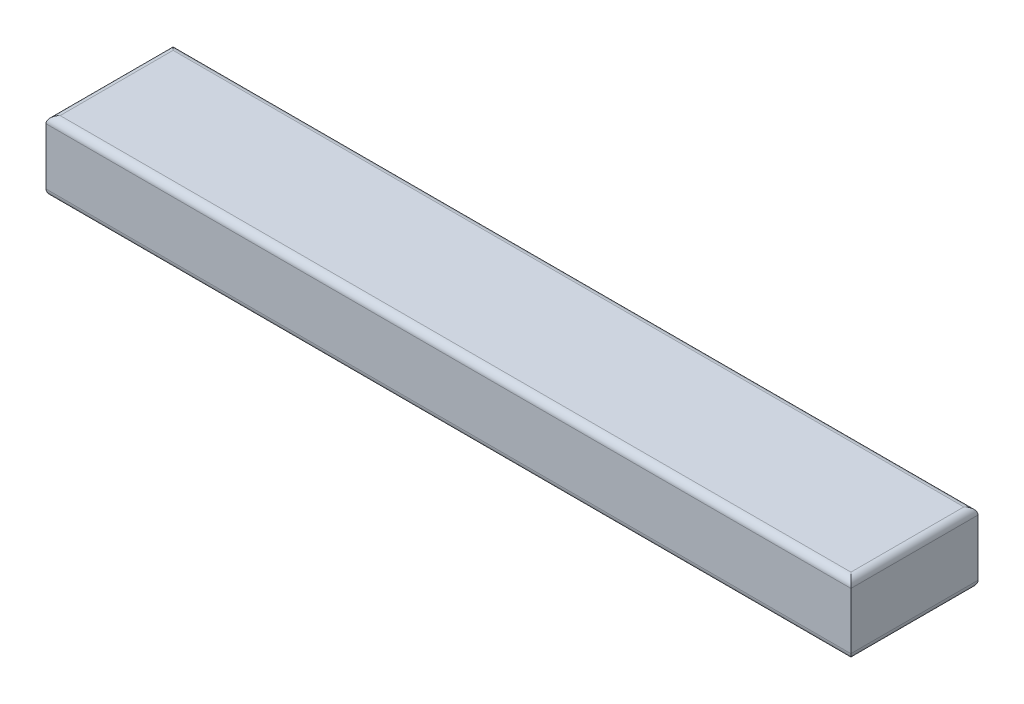
ISO-10303-21;
HEADER;
FILE_DESCRIPTION(('STEP AP214'),'2;1');
FILE_NAME('part.step','',(''),(''),'','','');
FILE_SCHEMA(('AUTOMOTIVE_DESIGN { 1 0 10303 214 1 1 1 1 }'));
ENDSEC;
DATA;
#1=APPLICATION_CONTEXT('core data for automotive mechanical design processes');
#2=APPLICATION_PROTOCOL_DEFINITION('international standard','automotive_design',2000,#1);
#3=PRODUCT_CONTEXT('',#1,'mechanical');
#4=PRODUCT('Part','Part','',(#3));
#5=PRODUCT_RELATED_PRODUCT_CATEGORY('part','',(#4));
#6=PRODUCT_DEFINITION_FORMATION('','',#4);
#7=PRODUCT_DEFINITION_CONTEXT('part definition',#1,'design');
#8=PRODUCT_DEFINITION('design','',#6,#7);
#9=PRODUCT_DEFINITION_SHAPE('','',#8);
#10=(LENGTH_UNIT() NAMED_UNIT(*) SI_UNIT(.MILLI.,.METRE.));
#11=(NAMED_UNIT(*) PLANE_ANGLE_UNIT() SI_UNIT($,.RADIAN.));
#12=(NAMED_UNIT(*) SI_UNIT($,.STERADIAN.) SOLID_ANGLE_UNIT());
#13=UNCERTAINTY_MEASURE_WITH_UNIT(LENGTH_MEASURE(1.E-05),#10,'distance_accuracy_value','');
#14=(GEOMETRIC_REPRESENTATION_CONTEXT(3) GLOBAL_UNCERTAINTY_ASSIGNED_CONTEXT((#13)) GLOBAL_UNIT_ASSIGNED_CONTEXT((#10,
#11,#12)) REPRESENTATION_CONTEXT('',''));
#15=CARTESIAN_POINT('',(0.,0.,0.));
#16=DIRECTION('',(0.,0.,1.));
#17=DIRECTION('',(1.,0.,0.));
#18=AXIS2_PLACEMENT_3D('',#15,#16,#17);
#19=CARTESIAN_POINT('',(-14.478,2.54,2.286));
#20=DIRECTION('',(1.,0.,0.));
#21=DIRECTION('',(0.,0.,-1.));
#22=AXIS2_PLACEMENT_3D('',#19,#20,#21);
#23=PLANE('',#22);
#24=DIRECTION('',(0.,-1.,0.));
#25=VECTOR('',#24,1.);
#26=CARTESIAN_POINT('',(-14.478,2.54,-2.286));
#27=LINE('',#26,#25);
#28=CARTESIAN_POINT('',(-14.478,2.286,-2.286));
#29=VERTEX_POINT('',#28);
#30=CARTESIAN_POINT('',(-14.478,0.254,-2.286));
#31=VERTEX_POINT('',#30);
#32=EDGE_CURVE('E153',#29,#31,#27,.T.);
#33=ORIENTED_EDGE('',*,*,#32,.T.);
#34=DIRECTION('',(0.,0.,1.));
#35=VECTOR('',#34,1.);
#36=CARTESIAN_POINT('',(-14.478,0.254,2.286));
#37=LINE('',#36,#35);
#38=CARTESIAN_POINT('',(-14.478,0.254,2.286));
#39=VERTEX_POINT('',#38);
#40=EDGE_CURVE('E162',#31,#39,#37,.T.);
#41=ORIENTED_EDGE('',*,*,#40,.T.);
#42=DIRECTION('',(0.,-1.,0.));
#43=VECTOR('',#42,1.);
#44=CARTESIAN_POINT('',(-14.478,2.54,2.286));
#45=LINE('',#44,#43);
#46=CARTESIAN_POINT('',(-14.478,2.286,2.286));
#47=VERTEX_POINT('',#46);
#48=EDGE_CURVE('E131',#47,#39,#45,.T.);
#49=ORIENTED_EDGE('',*,*,#48,.F.);
#50=DIRECTION('',(0.,0.,1.));
#51=VECTOR('',#50,1.);
#52=CARTESIAN_POINT('',(-14.478,2.286,-2.286));
#53=LINE('',#52,#51);
#54=EDGE_CURVE('E164',#47,#29,#53,.F.);
#55=ORIENTED_EDGE('',*,*,#54,.T.);
#56=EDGE_LOOP('',(#33,#41,#49,#55));
#57=FACE_BOUND('',#56,.T.);
#58=ADVANCED_FACE('F44',(#57),#23,.F.);
#59=CARTESIAN_POINT('',(14.478,2.54,2.286));
#60=DIRECTION('',(0.,0.,-1.));
#61=DIRECTION('',(-1.,0.,0.));
#62=AXIS2_PLACEMENT_3D('',#59,#60,#61);
#63=PLANE('',#62);
#64=ORIENTED_EDGE('',*,*,#48,.T.);
#65=DIRECTION('',(1.,0.,0.));
#66=VECTOR('',#65,1.);
#67=CARTESIAN_POINT('',(14.478,0.254,2.286));
#68=LINE('',#67,#66);
#69=CARTESIAN_POINT('',(14.478,0.254,2.286));
#70=VERTEX_POINT('',#69);
#71=EDGE_CURVE('E130',#39,#70,#68,.T.);
#72=ORIENTED_EDGE('',*,*,#71,.T.);
#73=DIRECTION('',(0.,-1.,0.));
#74=VECTOR('',#73,1.);
#75=CARTESIAN_POINT('',(14.478,2.54,2.286));
#76=LINE('',#75,#74);
#77=CARTESIAN_POINT('',(14.478,2.286,2.286));
#78=VERTEX_POINT('',#77);
#79=EDGE_CURVE('E113',#78,#70,#76,.T.);
#80=ORIENTED_EDGE('',*,*,#79,.F.);
#81=DIRECTION('',(1.,0.,0.));
#82=VECTOR('',#81,1.);
#83=CARTESIAN_POINT('',(-14.478,2.286,2.286));
#84=LINE('',#83,#82);
#85=EDGE_CURVE('E127',#78,#47,#84,.F.);
#86=ORIENTED_EDGE('',*,*,#85,.T.);
#87=EDGE_LOOP('',(#64,#72,#80,#86));
#88=FACE_BOUND('',#87,.T.);
#89=ADVANCED_FACE('F126',(#88),#63,.F.);
#90=CARTESIAN_POINT('',(14.478,2.54,2.286));
#91=DIRECTION('',(-1.,0.,0.));
#92=DIRECTION('',(0.,0.,1.));
#93=AXIS2_PLACEMENT_3D('',#90,#91,#92);
#94=PLANE('',#93);
#95=ORIENTED_EDGE('',*,*,#79,.T.);
#96=DIRECTION('',(0.,0.,-1.));
#97=VECTOR('',#96,1.);
#98=CARTESIAN_POINT('',(14.478,0.254,2.286));
#99=LINE('',#98,#97);
#100=CARTESIAN_POINT('',(14.478,0.254,-2.286));
#101=VERTEX_POINT('',#100);
#102=EDGE_CURVE('E119',#70,#101,#99,.T.);
#103=ORIENTED_EDGE('',*,*,#102,.T.);
#104=DIRECTION('',(0.,-1.,0.));
#105=VECTOR('',#104,1.);
#106=CARTESIAN_POINT('',(14.478,2.54,-2.286));
#107=LINE('',#106,#105);
#108=CARTESIAN_POINT('',(14.478,2.286,-2.286));
#109=VERTEX_POINT('',#108);
#110=EDGE_CURVE('E115',#109,#101,#107,.T.);
#111=ORIENTED_EDGE('',*,*,#110,.F.);
#112=DIRECTION('',(0.,0.,-1.));
#113=VECTOR('',#112,1.);
#114=CARTESIAN_POINT('',(14.478,2.286,2.286));
#115=LINE('',#114,#113);
#116=EDGE_CURVE('E110',#109,#78,#115,.F.);
#117=ORIENTED_EDGE('',*,*,#116,.T.);
#118=EDGE_LOOP('',(#95,#103,#111,#117));
#119=FACE_BOUND('',#118,.T.);
#120=ADVANCED_FACE('F112',(#119),#94,.F.);
#121=CARTESIAN_POINT('',(14.478,2.54,-2.286));
#122=DIRECTION('',(0.,0.,1.));
#123=DIRECTION('',(1.,0.,0.));
#124=AXIS2_PLACEMENT_3D('',#121,#122,#123);
#125=PLANE('',#124);
#126=ORIENTED_EDGE('',*,*,#110,.T.);
#127=DIRECTION('',(-1.,0.,0.));
#128=VECTOR('',#127,1.);
#129=CARTESIAN_POINT('',(14.478,0.254,-2.286));
#130=LINE('',#129,#128);
#131=EDGE_CURVE('E166',#101,#31,#130,.T.);
#132=ORIENTED_EDGE('',*,*,#131,.T.);
#133=ORIENTED_EDGE('',*,*,#32,.F.);
#134=DIRECTION('',(-1.,0.,0.));
#135=VECTOR('',#134,1.);
#136=CARTESIAN_POINT('',(14.478,2.286,-2.286));
#137=LINE('',#136,#135);
#138=EDGE_CURVE('E168',#29,#109,#137,.F.);
#139=ORIENTED_EDGE('',*,*,#138,.T.);
#140=EDGE_LOOP('',(#126,#132,#133,#139));
#141=FACE_BOUND('',#140,.T.);
#142=ADVANCED_FACE('F206',(#141),#125,.F.);
#143=CARTESIAN_POINT('',(0.,2.54,0.));
#144=DIRECTION('',(0.,1.,0.));
#145=DIRECTION('',(0.,0.,1.));
#146=AXIS2_PLACEMENT_3D('',#143,#144,#145);
#147=PLANE('',#146);
#148=DIRECTION('',(0.,0.,-1.));
#149=VECTOR('',#148,1.);
#150=CARTESIAN_POINT('',(14.224,2.54,-2.286));
#151=LINE('',#150,#149);
#152=CARTESIAN_POINT('',(14.224,2.54,2.032));
#153=VERTEX_POINT('',#152);
#154=CARTESIAN_POINT('',(14.224,2.54,-2.032));
#155=VERTEX_POINT('',#154);
#156=EDGE_CURVE('E53',#153,#155,#151,.T.);
#157=ORIENTED_EDGE('',*,*,#156,.T.);
#158=DIRECTION('',(-1.,0.,0.));
#159=VECTOR('',#158,1.);
#160=CARTESIAN_POINT('',(-14.478,2.54,-2.032));
#161=LINE('',#160,#159);
#162=CARTESIAN_POINT('',(-14.224,2.54,-2.032));
#163=VERTEX_POINT('',#162);
#164=EDGE_CURVE('E13',#155,#163,#161,.T.);
#165=ORIENTED_EDGE('',*,*,#164,.T.);
#166=DIRECTION('',(0.,0.,1.));
#167=VECTOR('',#166,1.);
#168=CARTESIAN_POINT('',(-14.224,2.54,2.286));
#169=LINE('',#168,#167);
#170=CARTESIAN_POINT('',(-14.224,2.54,2.032));
#171=VERTEX_POINT('',#170);
#172=EDGE_CURVE('E160',#163,#171,#169,.T.);
#173=ORIENTED_EDGE('',*,*,#172,.T.);
#174=DIRECTION('',(1.,0.,0.));
#175=VECTOR('',#174,1.);
#176=CARTESIAN_POINT('',(14.478,2.54,2.032));
#177=LINE('',#176,#175);
#178=EDGE_CURVE('E64',#171,#153,#177,.T.);
#179=ORIENTED_EDGE('',*,*,#178,.T.);
#180=EDGE_LOOP('',(#157,#165,#173,#179));
#181=FACE_BOUND('',#180,.T.);
#182=ADVANCED_FACE('F212',(#181),#147,.T.);
#183=CARTESIAN_POINT('',(0.,0.,0.));
#184=DIRECTION('',(0.,1.,0.));
#185=DIRECTION('',(0.,0.,1.));
#186=AXIS2_PLACEMENT_3D('',#183,#184,#185);
#187=PLANE('',#186);
#188=DIRECTION('',(0.,0.,-1.));
#189=VECTOR('',#188,1.);
#190=CARTESIAN_POINT('',(14.224,0.,0.));
#191=LINE('',#190,#189);
#192=CARTESIAN_POINT('',(14.224,0.,-2.032));
#193=VERTEX_POINT('',#192);
#194=CARTESIAN_POINT('',(14.224,0.,2.032));
#195=VERTEX_POINT('',#194);
#196=EDGE_CURVE('E173',#193,#195,#191,.F.);
#197=ORIENTED_EDGE('',*,*,#196,.T.);
#198=DIRECTION('',(1.,0.,0.));
#199=VECTOR('',#198,1.);
#200=CARTESIAN_POINT('',(0.,0.,2.032));
#201=LINE('',#200,#199);
#202=CARTESIAN_POINT('',(-14.224,0.,2.032));
#203=VERTEX_POINT('',#202);
#204=EDGE_CURVE('E120',#195,#203,#201,.F.);
#205=ORIENTED_EDGE('',*,*,#204,.T.);
#206=DIRECTION('',(0.,0.,1.));
#207=VECTOR('',#206,1.);
#208=CARTESIAN_POINT('',(-14.224,0.,0.));
#209=LINE('',#208,#207);
#210=CARTESIAN_POINT('',(-14.224,0.,-2.032));
#211=VERTEX_POINT('',#210);
#212=EDGE_CURVE('E177',#203,#211,#209,.F.);
#213=ORIENTED_EDGE('',*,*,#212,.T.);
#214=DIRECTION('',(-1.,0.,0.));
#215=VECTOR('',#214,1.);
#216=CARTESIAN_POINT('',(0.,0.,-2.032));
#217=LINE('',#216,#215);
#218=EDGE_CURVE('E175',#211,#193,#217,.F.);
#219=ORIENTED_EDGE('',*,*,#218,.T.);
#220=EDGE_LOOP('',(#197,#205,#213,#219));
#221=FACE_BOUND('',#220,.T.);
#222=ADVANCED_FACE('F214',(#221),#187,.F.);
#223=CARTESIAN_POINT('',(14.478,0.254,-2.032));
#224=DIRECTION('',(-1.,0.,0.));
#225=DIRECTION('',(0.,0.,1.));
#226=AXIS2_PLACEMENT_3D('',#223,#224,#225);
#227=CYLINDRICAL_SURFACE('',#226,0.254);
#228=CARTESIAN_POINT('',(14.224,0.254,-2.032));
#229=DIRECTION('',(-0.707106781186548,0.,-0.707106781186547));
#230=DIRECTION('',(-0.707106781186547,0.,0.707106781186548));
#231=AXIS2_PLACEMENT_3D('',#228,#229,#230);
#232=ELLIPSE('',#231,0.359210244842766,0.254);
#233=EDGE_CURVE('E154',#193,#101,#232,.F.);
#234=ORIENTED_EDGE('',*,*,#233,.F.);
#235=ORIENTED_EDGE('',*,*,#218,.F.);
#236=CARTESIAN_POINT('',(-14.224,0.254,-2.032));
#237=DIRECTION('',(-0.707106781186547,0.,0.707106781186548));
#238=DIRECTION('',(0.707106781186548,0.,0.707106781186547));
#239=AXIS2_PLACEMENT_3D('',#236,#237,#238);
#240=ELLIPSE('',#239,0.359210244842766,0.254);
#241=EDGE_CURVE('E150',#31,#211,#240,.T.);
#242=ORIENTED_EDGE('',*,*,#241,.F.);
#243=ORIENTED_EDGE('',*,*,#131,.F.);
#244=EDGE_LOOP('',(#234,#235,#242,#243));
#245=FACE_BOUND('',#244,.T.);
#246=ADVANCED_FACE('F193',(#245),#227,.T.);
#247=CARTESIAN_POINT('',(-14.224,0.254,2.286));
#248=DIRECTION('',(0.,0.,1.));
#249=DIRECTION('',(1.,0.,0.));
#250=AXIS2_PLACEMENT_3D('',#247,#248,#249);
#251=CYLINDRICAL_SURFACE('',#250,0.254);
#252=ORIENTED_EDGE('',*,*,#241,.T.);
#253=ORIENTED_EDGE('',*,*,#212,.F.);
#254=CARTESIAN_POINT('',(-14.224,0.254,2.032));
#255=DIRECTION('',(0.707106781186548,0.,0.707106781186547));
#256=DIRECTION('',(-0.707106781186547,0.,0.707106781186548));
#257=AXIS2_PLACEMENT_3D('',#254,#255,#256);
#258=ELLIPSE('',#257,0.359210244842766,0.254);
#259=EDGE_CURVE('E141',#39,#203,#258,.T.);
#260=ORIENTED_EDGE('',*,*,#259,.F.);
#261=ORIENTED_EDGE('',*,*,#40,.F.);
#262=EDGE_LOOP('',(#252,#253,#260,#261));
#263=FACE_BOUND('',#262,.T.);
#264=ADVANCED_FACE('F197',(#263),#251,.T.);
#265=CARTESIAN_POINT('',(14.224,0.254,2.286));
#266=DIRECTION('',(0.,0.,-1.));
#267=DIRECTION('',(-1.,0.,0.));
#268=AXIS2_PLACEMENT_3D('',#265,#266,#267);
#269=CYLINDRICAL_SURFACE('',#268,0.254);
#270=ORIENTED_EDGE('',*,*,#233,.T.);
#271=ORIENTED_EDGE('',*,*,#102,.F.);
#272=CARTESIAN_POINT('',(14.224,0.254,2.032));
#273=DIRECTION('',(0.707106781186547,0.,-0.707106781186548));
#274=DIRECTION('',(-0.707106781186548,0.,-0.707106781186547));
#275=AXIS2_PLACEMENT_3D('',#272,#273,#274);
#276=ELLIPSE('',#275,0.359210244842766,0.254);
#277=EDGE_CURVE('E140',#195,#70,#276,.F.);
#278=ORIENTED_EDGE('',*,*,#277,.F.);
#279=ORIENTED_EDGE('',*,*,#196,.F.);
#280=EDGE_LOOP('',(#270,#271,#278,#279));
#281=FACE_BOUND('',#280,.T.);
#282=ADVANCED_FACE('F205',(#281),#269,.T.);
#283=CARTESIAN_POINT('',(14.478,0.254,2.032));
#284=DIRECTION('',(1.,0.,0.));
#285=DIRECTION('',(0.,0.,-1.));
#286=AXIS2_PLACEMENT_3D('',#283,#284,#285);
#287=CYLINDRICAL_SURFACE('',#286,0.254);
#288=ORIENTED_EDGE('',*,*,#259,.T.);
#289=ORIENTED_EDGE('',*,*,#204,.F.);
#290=ORIENTED_EDGE('',*,*,#277,.T.);
#291=ORIENTED_EDGE('',*,*,#71,.F.);
#292=EDGE_LOOP('',(#288,#289,#290,#291));
#293=FACE_BOUND('',#292,.T.);
#294=ADVANCED_FACE('F200',(#293),#287,.T.);
#295=CARTESIAN_POINT('',(0.,2.286,2.032));
#296=DIRECTION('',(-1.,0.,0.));
#297=DIRECTION('',(0.,0.,1.));
#298=AXIS2_PLACEMENT_3D('',#295,#296,#297);
#299=CYLINDRICAL_SURFACE('',#298,0.254);
#300=CARTESIAN_POINT('',(-14.224,2.286,2.032));
#301=DIRECTION('',(-0.707106781186548,0.,-0.707106781186547));
#302=DIRECTION('',(0.707106781186547,0.,-0.707106781186548));
#303=AXIS2_PLACEMENT_3D('',#300,#301,#302);
#304=ELLIPSE('',#303,0.359210244842766,0.254);
#305=EDGE_CURVE('E136',#47,#171,#304,.T.);
#306=ORIENTED_EDGE('',*,*,#305,.F.);
#307=ORIENTED_EDGE('',*,*,#85,.F.);
#308=CARTESIAN_POINT('',(14.224,2.286,2.032));
#309=DIRECTION('',(-0.707106781186547,0.,0.707106781186548));
#310=DIRECTION('',(-0.707106781186548,0.,-0.707106781186547));
#311=AXIS2_PLACEMENT_3D('',#308,#309,#310);
#312=ELLIPSE('',#311,0.359210244842766,0.254);
#313=EDGE_CURVE('E48',#153,#78,#312,.F.);
#314=ORIENTED_EDGE('',*,*,#313,.F.);
#315=ORIENTED_EDGE('',*,*,#178,.F.);
#316=EDGE_LOOP('',(#306,#307,#314,#315));
#317=FACE_BOUND('',#316,.T.);
#318=ADVANCED_FACE('F46',(#317),#299,.T.);
#319=CARTESIAN_POINT('',(14.224,2.286,0.));
#320=DIRECTION('',(0.,0.,1.));
#321=DIRECTION('',(1.,0.,0.));
#322=AXIS2_PLACEMENT_3D('',#319,#320,#321);
#323=CYLINDRICAL_SURFACE('',#322,0.254);
#324=ORIENTED_EDGE('',*,*,#313,.T.);
#325=ORIENTED_EDGE('',*,*,#116,.F.);
#326=CARTESIAN_POINT('',(14.224,2.286,-2.032));
#327=DIRECTION('',(0.707106781186548,0.,0.707106781186547));
#328=DIRECTION('',(-0.707106781186547,0.,0.707106781186548));
#329=AXIS2_PLACEMENT_3D('',#326,#327,#328);
#330=ELLIPSE('',#329,0.359210244842766,0.254);
#331=EDGE_CURVE('E143',#155,#109,#330,.F.);
#332=ORIENTED_EDGE('',*,*,#331,.F.);
#333=ORIENTED_EDGE('',*,*,#156,.F.);
#334=EDGE_LOOP('',(#324,#325,#332,#333));
#335=FACE_BOUND('',#334,.T.);
#336=ADVANCED_FACE('F139',(#335),#323,.T.);
#337=CARTESIAN_POINT('',(-14.224,2.286,0.));
#338=DIRECTION('',(0.,0.,-1.));
#339=DIRECTION('',(-1.,0.,0.));
#340=AXIS2_PLACEMENT_3D('',#337,#338,#339);
#341=CYLINDRICAL_SURFACE('',#340,0.254);
#342=ORIENTED_EDGE('',*,*,#305,.T.);
#343=ORIENTED_EDGE('',*,*,#172,.F.);
#344=CARTESIAN_POINT('',(-14.224,2.286,-2.032));
#345=DIRECTION('',(0.707106781186547,0.,-0.707106781186548));
#346=DIRECTION('',(-0.707106781186548,0.,-0.707106781186547));
#347=AXIS2_PLACEMENT_3D('',#344,#345,#346);
#348=ELLIPSE('',#347,0.359210244842766,0.254);
#349=EDGE_CURVE('E146',#29,#163,#348,.T.);
#350=ORIENTED_EDGE('',*,*,#349,.F.);
#351=ORIENTED_EDGE('',*,*,#54,.F.);
#352=EDGE_LOOP('',(#342,#343,#350,#351));
#353=FACE_BOUND('',#352,.T.);
#354=ADVANCED_FACE('F211',(#353),#341,.T.);
#355=CARTESIAN_POINT('',(0.,2.286,-2.032));
#356=DIRECTION('',(1.,0.,0.));
#357=DIRECTION('',(0.,0.,-1.));
#358=AXIS2_PLACEMENT_3D('',#355,#356,#357);
#359=CYLINDRICAL_SURFACE('',#358,0.254);
#360=ORIENTED_EDGE('',*,*,#331,.T.);
#361=ORIENTED_EDGE('',*,*,#138,.F.);
#362=ORIENTED_EDGE('',*,*,#349,.T.);
#363=ORIENTED_EDGE('',*,*,#164,.F.);
#364=EDGE_LOOP('',(#360,#361,#362,#363));
#365=FACE_BOUND('',#364,.T.);
#366=ADVANCED_FACE('F209',(#365),#359,.T.);
#367=CLOSED_SHELL('',(#58,#89,#120,#142,#182,#222,#246,#264,#282,#294,#318,#336,#354,#366));
#368=MANIFOLD_SOLID_BREP('B2',#367);
#369=ADVANCED_BREP_SHAPE_REPRESENTATION('',(#18,#368),#14);
#370=SHAPE_DEFINITION_REPRESENTATION(#9,#369);
ENDSEC;
END-ISO-10303-21;
